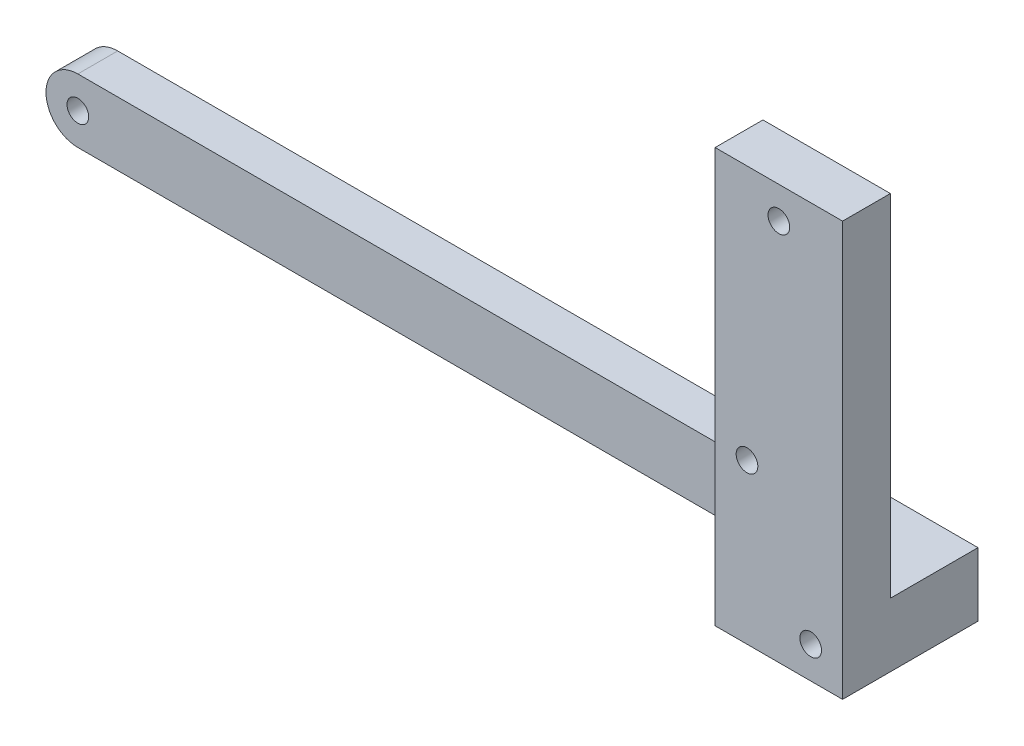
ISO-10303-21;
HEADER;
FILE_DESCRIPTION(('STEP AP214'),'2;1');
FILE_NAME('part.step','',(''),(''),'','','');
FILE_SCHEMA(('AUTOMOTIVE_DESIGN { 1 0 10303 214 1 1 1 1 }'));
ENDSEC;
DATA;
#1=APPLICATION_CONTEXT('core data for automotive mechanical design processes');
#2=APPLICATION_PROTOCOL_DEFINITION('international standard','automotive_design',2000,#1);
#3=PRODUCT_CONTEXT('',#1,'mechanical');
#4=PRODUCT('Part','Part','',(#3));
#5=PRODUCT_RELATED_PRODUCT_CATEGORY('part','',(#4));
#6=PRODUCT_DEFINITION_FORMATION('','',#4);
#7=PRODUCT_DEFINITION_CONTEXT('part definition',#1,'design');
#8=PRODUCT_DEFINITION('design','',#6,#7);
#9=PRODUCT_DEFINITION_SHAPE('','',#8);
#10=(LENGTH_UNIT() NAMED_UNIT(*) SI_UNIT(.MILLI.,.METRE.));
#11=(NAMED_UNIT(*) PLANE_ANGLE_UNIT() SI_UNIT($,.RADIAN.));
#12=(NAMED_UNIT(*) SI_UNIT($,.STERADIAN.) SOLID_ANGLE_UNIT());
#13=UNCERTAINTY_MEASURE_WITH_UNIT(LENGTH_MEASURE(1.E-05),#10,'distance_accuracy_value','');
#14=(GEOMETRIC_REPRESENTATION_CONTEXT(3) GLOBAL_UNCERTAINTY_ASSIGNED_CONTEXT((#13)) GLOBAL_UNIT_ASSIGNED_CONTEXT((#10,
#11,#12)) REPRESENTATION_CONTEXT('',''));
#15=CARTESIAN_POINT('',(0.,0.,0.));
#16=DIRECTION('',(0.,0.,1.));
#17=DIRECTION('',(1.,0.,0.));
#18=AXIS2_PLACEMENT_3D('',#15,#16,#17);
#19=CARTESIAN_POINT('',(-158.75,-69.850000000002,-9.525));
#20=DIRECTION('',(0.,0.,1.));
#21=DIRECTION('',(1.,0.,0.));
#22=AXIS2_PLACEMENT_3D('',#19,#20,#21);
#23=PLANE('',#22);
#24=CARTESIAN_POINT('',(-158.75,-69.850000000002,-9.525));
#25=DIRECTION('',(0.,0.,1.));
#26=DIRECTION('',(1.,0.,0.));
#27=AXIS2_PLACEMENT_3D('',#24,#25,#26);
#28=CIRCLE('',#27,6.34999999999999);
#29=CARTESIAN_POINT('',(-158.75,-63.500000000002,-9.525));
#30=VERTEX_POINT('',#29);
#31=CARTESIAN_POINT('',(-158.75,-76.2000000000019,-9.525));
#32=VERTEX_POINT('',#31);
#33=EDGE_CURVE('E101',#30,#32,#28,.T.);
#34=ORIENTED_EDGE('',*,*,#33,.T.);
#35=DIRECTION('',(1.,0.,0.));
#36=VECTOR('',#35,1.);
#37=CARTESIAN_POINT('',(-158.75,-76.2000000000019,-9.525));
#38=LINE('',#37,#36);
#39=CARTESIAN_POINT('',(12.7,-76.2,-9.525));
#40=VERTEX_POINT('',#39);
#41=EDGE_CURVE('E96',#32,#40,#38,.T.);
#42=ORIENTED_EDGE('',*,*,#41,.T.);
#43=DIRECTION('',(0.,1.,0.));
#44=VECTOR('',#43,1.);
#45=CARTESIAN_POINT('',(12.7,-76.2,-9.525));
#46=LINE('',#45,#44);
#47=CARTESIAN_POINT('',(12.7000000000005,-63.500000000002,-9.525));
#48=VERTEX_POINT('',#47);
#49=EDGE_CURVE('E99',#40,#48,#46,.T.);
#50=ORIENTED_EDGE('',*,*,#49,.T.);
#51=DIRECTION('',(-1.,0.,0.));
#52=VECTOR('',#51,1.);
#53=CARTESIAN_POINT('',(12.7000000000005,-63.500000000002,-9.525));
#54=LINE('',#53,#52);
#55=EDGE_CURVE('E66',#48,#30,#54,.T.);
#56=ORIENTED_EDGE('',*,*,#55,.T.);
#57=EDGE_LOOP('',(#34,#42,#50,#56));
#58=FACE_BOUND('',#57,.T.);
#59=CARTESIAN_POINT('',(-158.75,-69.850000000002,-9.525));
#60=DIRECTION('',(0.,0.,1.));
#61=DIRECTION('',(1.,0.,0.));
#62=AXIS2_PLACEMENT_3D('',#59,#60,#61);
#63=CIRCLE('',#62,2.15899999999999);
#64=CARTESIAN_POINT('',(-156.591,-69.850000000002,-9.525));
#65=VERTEX_POINT('',#64);
#66=EDGE_CURVE('E116',#65,#65,#63,.T.);
#67=ORIENTED_EDGE('',*,*,#66,.F.);
#68=EDGE_LOOP('',(#67));
#69=FACE_BOUND('',#68,.T.);
#70=ADVANCED_FACE('F49',(#58,#69),#23,.T.);
#71=CARTESIAN_POINT('',(-158.75,-69.850000000002,-17.4625));
#72=DIRECTION('',(0.,0.,1.));
#73=DIRECTION('',(1.,0.,0.));
#74=AXIS2_PLACEMENT_3D('',#71,#72,#73);
#75=PLANE('',#74);
#76=CARTESIAN_POINT('',(-158.75,-69.850000000002,-17.4625));
#77=DIRECTION('',(0.,0.,1.));
#78=DIRECTION('',(1.,0.,0.));
#79=AXIS2_PLACEMENT_3D('',#76,#77,#78);
#80=CIRCLE('',#79,6.34999999999999);
#81=CARTESIAN_POINT('',(-158.75,-63.500000000002,-17.4625));
#82=VERTEX_POINT('',#81);
#83=CARTESIAN_POINT('',(-158.75,-76.2000000000019,-17.4625));
#84=VERTEX_POINT('',#83);
#85=EDGE_CURVE('E113',#82,#84,#80,.T.);
#86=ORIENTED_EDGE('',*,*,#85,.F.);
#87=DIRECTION('',(-1.,0.,0.));
#88=VECTOR('',#87,1.);
#89=CARTESIAN_POINT('',(12.7000000000005,-63.500000000002,-17.4625));
#90=LINE('',#89,#88);
#91=CARTESIAN_POINT('',(12.7000000000005,-63.500000000002,-17.4625));
#92=VERTEX_POINT('',#91);
#93=EDGE_CURVE('E89',#92,#82,#90,.T.);
#94=ORIENTED_EDGE('',*,*,#93,.F.);
#95=DIRECTION('',(0.,1.,0.));
#96=VECTOR('',#95,1.);
#97=CARTESIAN_POINT('',(12.7,-76.2,-17.4625));
#98=LINE('',#97,#96);
#99=CARTESIAN_POINT('',(12.7,-76.2,-17.4625));
#100=VERTEX_POINT('',#99);
#101=EDGE_CURVE('E83',#100,#92,#98,.T.);
#102=ORIENTED_EDGE('',*,*,#101,.F.);
#103=DIRECTION('',(1.,0.,0.));
#104=VECTOR('',#103,1.);
#105=CARTESIAN_POINT('',(-158.75,-76.2000000000019,-17.4625));
#106=LINE('',#105,#104);
#107=EDGE_CURVE('E105',#84,#100,#106,.T.);
#108=ORIENTED_EDGE('',*,*,#107,.F.);
#109=EDGE_LOOP('',(#86,#94,#102,#108));
#110=FACE_BOUND('',#109,.T.);
#111=CARTESIAN_POINT('',(-158.75,-69.850000000002,-17.4625));
#112=DIRECTION('',(0.,0.,1.));
#113=DIRECTION('',(1.,0.,0.));
#114=AXIS2_PLACEMENT_3D('',#111,#112,#113);
#115=CIRCLE('',#114,2.15899999999999);
#116=CARTESIAN_POINT('',(-156.591,-69.850000000002,-17.4625));
#117=VERTEX_POINT('',#116);
#118=EDGE_CURVE('E128',#117,#117,#115,.T.);
#119=ORIENTED_EDGE('',*,*,#118,.T.);
#120=EDGE_LOOP('',(#119));
#121=FACE_BOUND('',#120,.T.);
#122=ADVANCED_FACE('F124',(#110,#121),#75,.F.);
#123=CARTESIAN_POINT('',(-158.75,-69.850000000002,-9.525));
#124=DIRECTION('',(0.,0.,-1.));
#125=DIRECTION('',(-1.,0.,0.));
#126=AXIS2_PLACEMENT_3D('',#123,#124,#125);
#127=CYLINDRICAL_SURFACE('',#126,6.34999999999999);
#128=ORIENTED_EDGE('',*,*,#85,.T.);
#129=DIRECTION('',(0.,0.,-1.));
#130=VECTOR('',#129,1.);
#131=CARTESIAN_POINT('',(-158.75,-76.2000000000019,-9.525));
#132=LINE('',#131,#130);
#133=EDGE_CURVE('E12',#32,#84,#132,.T.);
#134=ORIENTED_EDGE('',*,*,#133,.F.);
#135=ORIENTED_EDGE('',*,*,#33,.F.);
#136=DIRECTION('',(0.,0.,-1.));
#137=VECTOR('',#136,1.);
#138=CARTESIAN_POINT('',(-158.75,-63.500000000002,-9.525));
#139=LINE('',#138,#137);
#140=EDGE_CURVE('E109',#30,#82,#139,.T.);
#141=ORIENTED_EDGE('',*,*,#140,.T.);
#142=EDGE_LOOP('',(#128,#134,#135,#141));
#143=FACE_BOUND('',#142,.T.);
#144=ADVANCED_FACE('F51',(#143),#127,.T.);
#145=CARTESIAN_POINT('',(-158.75,-76.2000000000019,-9.525));
#146=DIRECTION('',(0.,1.,0.));
#147=DIRECTION('',(-1.,0.,0.));
#148=AXIS2_PLACEMENT_3D('',#145,#146,#147);
#149=PLANE('',#148);
#150=ORIENTED_EDGE('',*,*,#107,.T.);
#151=DIRECTION('',(0.,0.,-1.));
#152=VECTOR('',#151,1.);
#153=CARTESIAN_POINT('',(12.7,-76.2,-9.525));
#154=LINE('',#153,#152);
#155=EDGE_CURVE('E58',#40,#100,#154,.T.);
#156=ORIENTED_EDGE('',*,*,#155,.F.);
#157=ORIENTED_EDGE('',*,*,#41,.F.);
#158=ORIENTED_EDGE('',*,*,#133,.T.);
#159=EDGE_LOOP('',(#150,#156,#157,#158));
#160=FACE_BOUND('',#159,.T.);
#161=ADVANCED_FACE('F104',(#160),#149,.F.);
#162=CARTESIAN_POINT('',(12.7,-76.2,-9.525));
#163=DIRECTION('',(-1.,0.,0.));
#164=DIRECTION('',(0.,-1.,0.));
#165=AXIS2_PLACEMENT_3D('',#162,#163,#164);
#166=PLANE('',#165);
#167=ORIENTED_EDGE('',*,*,#101,.T.);
#168=DIRECTION('',(0.,0.,-1.));
#169=VECTOR('',#168,1.);
#170=CARTESIAN_POINT('',(12.7000000000005,-63.500000000002,-9.525));
#171=LINE('',#170,#169);
#172=EDGE_CURVE('E106',#48,#92,#171,.T.);
#173=ORIENTED_EDGE('',*,*,#172,.F.);
#174=ORIENTED_EDGE('',*,*,#49,.F.);
#175=ORIENTED_EDGE('',*,*,#155,.T.);
#176=EDGE_LOOP('',(#167,#173,#174,#175));
#177=FACE_BOUND('',#176,.T.);
#178=ADVANCED_FACE('F107',(#177),#166,.F.);
#179=CARTESIAN_POINT('',(12.7000000000005,-63.500000000002,-9.525));
#180=DIRECTION('',(0.,-1.,0.));
#181=DIRECTION('',(0.,0.,-1.));
#182=AXIS2_PLACEMENT_3D('',#179,#180,#181);
#183=PLANE('',#182);
#184=ORIENTED_EDGE('',*,*,#93,.T.);
#185=ORIENTED_EDGE('',*,*,#140,.F.);
#186=ORIENTED_EDGE('',*,*,#55,.F.);
#187=ORIENTED_EDGE('',*,*,#172,.T.);
#188=EDGE_LOOP('',(#184,#185,#186,#187));
#189=FACE_BOUND('',#188,.T.);
#190=ADVANCED_FACE('F121',(#189),#183,.F.);
#191=CARTESIAN_POINT('',(-158.75,-69.850000000002,-9.525));
#192=DIRECTION('',(0.,0.,-1.));
#193=DIRECTION('',(-1.,0.,0.));
#194=AXIS2_PLACEMENT_3D('',#191,#192,#193);
#195=CYLINDRICAL_SURFACE('',#194,2.15899999999999);
#196=ORIENTED_EDGE('',*,*,#66,.T.);
#197=EDGE_LOOP('',(#196));
#198=FACE_BOUND('',#197,.T.);
#199=ORIENTED_EDGE('',*,*,#118,.F.);
#200=EDGE_LOOP('',(#199));
#201=FACE_BOUND('',#200,.T.);
#202=ADVANCED_FACE('F134',(#198,#201),#195,.F.);
#203=CLOSED_SHELL('',(#70,#122,#144,#161,#178,#190,#202));
#204=MANIFOLD_SOLID_BREP('B2',#203);
#205=CARTESIAN_POINT('',(0.,0.,9.525));
#206=DIRECTION('',(0.,0.,1.));
#207=DIRECTION('',(1.,0.,0.));
#208=AXIS2_PLACEMENT_3D('',#205,#206,#207);
#209=PLANE('',#208);
#210=CARTESIAN_POINT('',(-6.35,-44.45,9.525));
#211=DIRECTION('',(0.,0.,1.));
#212=DIRECTION('',(1.,0.,0.));
#213=AXIS2_PLACEMENT_3D('',#210,#211,#212);
#214=CIRCLE('',#213,2.159);
#215=CARTESIAN_POINT('',(-8.50900000000001,-44.45,9.525));
#216=VERTEX_POINT('',#215);
#217=EDGE_CURVE('E289',#216,#216,#214,.T.);
#218=ORIENTED_EDGE('',*,*,#217,.F.);
#219=EDGE_LOOP('',(#218));
#220=FACE_BOUND('',#219,.T.);
#221=DIRECTION('',(0.,-1.,0.));
#222=VECTOR('',#221,1.);
#223=CARTESIAN_POINT('',(-12.7,6.35,9.525));
#224=LINE('',#223,#222);
#225=CARTESIAN_POINT('',(-12.7,6.35,9.525));
#226=VERTEX_POINT('',#225);
#227=CARTESIAN_POINT('',(-12.7,-76.2,9.525));
#228=VERTEX_POINT('',#227);
#229=EDGE_CURVE('E301',#226,#228,#224,.T.);
#230=ORIENTED_EDGE('',*,*,#229,.T.);
#231=DIRECTION('',(1.,0.,0.));
#232=VECTOR('',#231,1.);
#233=CARTESIAN_POINT('',(-12.7,-76.2,9.525));
#234=LINE('',#233,#232);
#235=CARTESIAN_POINT('',(12.7,-76.2,9.525));
#236=VERTEX_POINT('',#235);
#237=EDGE_CURVE('E240',#228,#236,#234,.T.);
#238=ORIENTED_EDGE('',*,*,#237,.T.);
#239=DIRECTION('',(0.,1.,0.));
#240=VECTOR('',#239,1.);
#241=CARTESIAN_POINT('',(12.7,6.34999999999999,9.525));
#242=LINE('',#241,#240);
#243=CARTESIAN_POINT('',(12.7,6.34999999999999,9.525));
#244=VERTEX_POINT('',#243);
#245=EDGE_CURVE('E304',#236,#244,#242,.T.);
#246=ORIENTED_EDGE('',*,*,#245,.T.);
#247=DIRECTION('',(-1.,0.,0.));
#248=VECTOR('',#247,1.);
#249=CARTESIAN_POINT('',(-12.7,6.35,9.525));
#250=LINE('',#249,#248);
#251=EDGE_CURVE('E218',#244,#226,#250,.T.);
#252=ORIENTED_EDGE('',*,*,#251,.T.);
#253=EDGE_LOOP('',(#230,#238,#246,#252));
#254=FACE_BOUND('',#253,.T.);
#255=CARTESIAN_POINT('',(0.,0.,9.525));
#256=DIRECTION('',(0.,0.,1.));
#257=DIRECTION('',(1.,0.,0.));
#258=AXIS2_PLACEMENT_3D('',#255,#256,#257);
#259=CIRCLE('',#258,2.159);
#260=CARTESIAN_POINT('',(-2.159,0.,9.525));
#261=VERTEX_POINT('',#260);
#262=EDGE_CURVE('E295',#261,#261,#259,.T.);
#263=ORIENTED_EDGE('',*,*,#262,.F.);
#264=EDGE_LOOP('',(#263));
#265=FACE_BOUND('',#264,.T.);
#266=CARTESIAN_POINT('',(6.35,-69.85,9.525));
#267=DIRECTION('',(0.,0.,1.));
#268=DIRECTION('',(1.,0.,0.));
#269=AXIS2_PLACEMENT_3D('',#266,#267,#268);
#270=CIRCLE('',#269,2.159);
#271=CARTESIAN_POINT('',(4.191,-69.85,9.525));
#272=VERTEX_POINT('',#271);
#273=EDGE_CURVE('E262',#272,#272,#270,.T.);
#274=ORIENTED_EDGE('',*,*,#273,.F.);
#275=EDGE_LOOP('',(#274));
#276=FACE_BOUND('',#275,.T.);
#277=ADVANCED_FACE('F194',(#220,#254,#265,#276),#209,.T.);
#278=CARTESIAN_POINT('',(0.,0.,0.));
#279=DIRECTION('',(0.,0.,1.));
#280=DIRECTION('',(1.,0.,0.));
#281=AXIS2_PLACEMENT_3D('',#278,#279,#280);
#282=PLANE('',#281);
#283=DIRECTION('',(0.,1.,0.));
#284=VECTOR('',#283,1.);
#285=CARTESIAN_POINT('',(12.7,6.34999999999999,0.));
#286=LINE('',#285,#284);
#287=CARTESIAN_POINT('',(12.7000000000005,-63.500000000002,0.));
#288=VERTEX_POINT('',#287);
#289=CARTESIAN_POINT('',(12.7,6.34999999999999,0.));
#290=VERTEX_POINT('',#289);
#291=EDGE_CURVE('E310',#288,#290,#286,.T.);
#292=ORIENTED_EDGE('',*,*,#291,.F.);
#293=DIRECTION('',(-1.,0.,0.));
#294=VECTOR('',#293,1.);
#295=CARTESIAN_POINT('',(12.7000000000005,-63.500000000002,0.));
#296=LINE('',#295,#294);
#297=CARTESIAN_POINT('',(-12.7,-63.500000000002,0.));
#298=VERTEX_POINT('',#297);
#299=EDGE_CURVE('E258',#288,#298,#296,.T.);
#300=ORIENTED_EDGE('',*,*,#299,.T.);
#301=DIRECTION('',(0.,-1.,0.));
#302=VECTOR('',#301,1.);
#303=CARTESIAN_POINT('',(-12.7,6.35,0.));
#304=LINE('',#303,#302);
#305=CARTESIAN_POINT('',(-12.7,6.35,0.));
#306=VERTEX_POINT('',#305);
#307=EDGE_CURVE('E298',#306,#298,#304,.T.);
#308=ORIENTED_EDGE('',*,*,#307,.F.);
#309=DIRECTION('',(-1.,0.,0.));
#310=VECTOR('',#309,1.);
#311=CARTESIAN_POINT('',(-12.7,6.35,0.));
#312=LINE('',#311,#310);
#313=EDGE_CURVE('E233',#290,#306,#312,.T.);
#314=ORIENTED_EDGE('',*,*,#313,.F.);
#315=EDGE_LOOP('',(#292,#300,#308,#314));
#316=FACE_BOUND('',#315,.T.);
#317=CARTESIAN_POINT('',(0.,0.,0.));
#318=DIRECTION('',(0.,0.,1.));
#319=DIRECTION('',(1.,0.,0.));
#320=AXIS2_PLACEMENT_3D('',#317,#318,#319);
#321=CIRCLE('',#320,2.159);
#322=CARTESIAN_POINT('',(-2.159,0.,0.));
#323=VERTEX_POINT('',#322);
#324=EDGE_CURVE('E292',#323,#323,#321,.T.);
#325=ORIENTED_EDGE('',*,*,#324,.T.);
#326=EDGE_LOOP('',(#325));
#327=FACE_BOUND('',#326,.T.);
#328=CARTESIAN_POINT('',(-6.35,-44.45,0.));
#329=DIRECTION('',(0.,0.,1.));
#330=DIRECTION('',(1.,0.,0.));
#331=AXIS2_PLACEMENT_3D('',#328,#329,#330);
#332=CIRCLE('',#331,2.159);
#333=CARTESIAN_POINT('',(-8.50900000000001,-44.45,0.));
#334=VERTEX_POINT('',#333);
#335=EDGE_CURVE('E288',#334,#334,#332,.T.);
#336=ORIENTED_EDGE('',*,*,#335,.T.);
#337=EDGE_LOOP('',(#336));
#338=FACE_BOUND('',#337,.T.);
#339=ADVANCED_FACE('F319',(#316,#327,#338),#282,.F.);
#340=CARTESIAN_POINT('',(-12.7,6.35,9.525));
#341=DIRECTION('',(1.,0.,0.));
#342=DIRECTION('',(0.,1.,0.));
#343=AXIS2_PLACEMENT_3D('',#340,#341,#342);
#344=PLANE('',#343);
#345=ORIENTED_EDGE('',*,*,#307,.T.);
#346=DIRECTION('',(0.,0.,-1.));
#347=VECTOR('',#346,1.);
#348=CARTESIAN_POINT('',(-12.6999999999995,-63.500000000002,28.3980633142469));
#349=LINE('',#348,#347);
#350=CARTESIAN_POINT('',(-12.6999999999995,-63.500000000002,-17.4625));
#351=VERTEX_POINT('',#350);
#352=EDGE_CURVE('E209',#298,#351,#349,.T.);
#353=ORIENTED_EDGE('',*,*,#352,.T.);
#354=DIRECTION('',(0.,-1.,0.));
#355=VECTOR('',#354,1.);
#356=CARTESIAN_POINT('',(-12.6999999999995,-63.500000000002,-17.4625));
#357=LINE('',#356,#355);
#358=CARTESIAN_POINT('',(-12.7,-76.2,-17.4625));
#359=VERTEX_POINT('',#358);
#360=EDGE_CURVE('E271',#351,#359,#357,.T.);
#361=ORIENTED_EDGE('',*,*,#360,.T.);
#362=DIRECTION('',(0.,0.,-1.));
#363=VECTOR('',#362,1.);
#364=CARTESIAN_POINT('',(-12.7,-76.2,9.525));
#365=LINE('',#364,#363);
#366=EDGE_CURVE('E47',#228,#359,#365,.T.);
#367=ORIENTED_EDGE('',*,*,#366,.F.);
#368=ORIENTED_EDGE('',*,*,#229,.F.);
#369=DIRECTION('',(0.,0.,-1.));
#370=VECTOR('',#369,1.);
#371=CARTESIAN_POINT('',(-12.7,6.35,9.525));
#372=LINE('',#371,#370);
#373=EDGE_CURVE('E307',#226,#306,#372,.T.);
#374=ORIENTED_EDGE('',*,*,#373,.T.);
#375=EDGE_LOOP('',(#345,#353,#361,#367,#368,#374));
#376=FACE_BOUND('',#375,.T.);
#377=ADVANCED_FACE('F196',(#376),#344,.F.);
#378=CARTESIAN_POINT('',(-12.7,-76.2,9.525));
#379=DIRECTION('',(0.,1.,0.));
#380=DIRECTION('',(0.,0.,1.));
#381=AXIS2_PLACEMENT_3D('',#378,#379,#380);
#382=PLANE('',#381);
#383=ORIENTED_EDGE('',*,*,#366,.T.);
#384=DIRECTION('',(1.,0.,0.));
#385=VECTOR('',#384,1.);
#386=CARTESIAN_POINT('',(12.7000000000005,-76.2,-17.4625));
#387=LINE('',#386,#385);
#388=CARTESIAN_POINT('',(12.7000000000005,-76.2,-17.4625));
#389=VERTEX_POINT('',#388);
#390=EDGE_CURVE('E283',#359,#389,#387,.T.);
#391=ORIENTED_EDGE('',*,*,#390,.T.);
#392=DIRECTION('',(0.,0.,-1.));
#393=VECTOR('',#392,1.);
#394=CARTESIAN_POINT('',(12.7,-76.2,9.525));
#395=LINE('',#394,#393);
#396=EDGE_CURVE('E202',#236,#389,#395,.T.);
#397=ORIENTED_EDGE('',*,*,#396,.F.);
#398=ORIENTED_EDGE('',*,*,#237,.F.);
#399=EDGE_LOOP('',(#383,#391,#397,#398));
#400=FACE_BOUND('',#399,.T.);
#401=ADVANCED_FACE('F325',(#400),#382,.F.);
#402=CARTESIAN_POINT('',(12.7,6.34999999999999,9.525));
#403=DIRECTION('',(-1.,0.,0.));
#404=DIRECTION('',(0.,-1.,0.));
#405=AXIS2_PLACEMENT_3D('',#402,#403,#404);
#406=PLANE('',#405);
#407=ORIENTED_EDGE('',*,*,#396,.T.);
#408=DIRECTION('',(0.,1.,0.));
#409=VECTOR('',#408,1.);
#410=CARTESIAN_POINT('',(12.7000000000005,-63.500000000002,-17.4625));
#411=LINE('',#410,#409);
#412=CARTESIAN_POINT('',(12.7000000000005,-63.500000000002,-17.4625));
#413=VERTEX_POINT('',#412);
#414=EDGE_CURVE('E269',#389,#413,#411,.T.);
#415=ORIENTED_EDGE('',*,*,#414,.T.);
#416=DIRECTION('',(0.,0.,-1.));
#417=VECTOR('',#416,1.);
#418=CARTESIAN_POINT('',(12.7000000000005,-63.500000000002,28.3980633142469));
#419=LINE('',#418,#417);
#420=EDGE_CURVE('E253',#288,#413,#419,.T.);
#421=ORIENTED_EDGE('',*,*,#420,.F.);
#422=ORIENTED_EDGE('',*,*,#291,.T.);
#423=DIRECTION('',(0.,0.,-1.));
#424=VECTOR('',#423,1.);
#425=CARTESIAN_POINT('',(12.7,6.34999999999999,9.525));
#426=LINE('',#425,#424);
#427=EDGE_CURVE('E314',#244,#290,#426,.T.);
#428=ORIENTED_EDGE('',*,*,#427,.F.);
#429=ORIENTED_EDGE('',*,*,#245,.F.);
#430=EDGE_LOOP('',(#407,#415,#421,#422,#428,#429));
#431=FACE_BOUND('',#430,.T.);
#432=ADVANCED_FACE('F273',(#431),#406,.F.);
#433=CARTESIAN_POINT('',(-12.7,6.35,9.525));
#434=DIRECTION('',(0.,-1.,0.));
#435=DIRECTION('',(1.,0.,0.));
#436=AXIS2_PLACEMENT_3D('',#433,#434,#435);
#437=PLANE('',#436);
#438=ORIENTED_EDGE('',*,*,#313,.T.);
#439=ORIENTED_EDGE('',*,*,#373,.F.);
#440=ORIENTED_EDGE('',*,*,#251,.F.);
#441=ORIENTED_EDGE('',*,*,#427,.T.);
#442=EDGE_LOOP('',(#438,#439,#440,#441));
#443=FACE_BOUND('',#442,.T.);
#444=ADVANCED_FACE('F316',(#443),#437,.F.);
#445=CARTESIAN_POINT('',(0.,0.,9.525));
#446=DIRECTION('',(0.,0.,-1.));
#447=DIRECTION('',(-1.,0.,0.));
#448=AXIS2_PLACEMENT_3D('',#445,#446,#447);
#449=CYLINDRICAL_SURFACE('',#448,2.159);
#450=CARTESIAN_POINT('',(-2.159,0.,9.525));
#451=CARTESIAN_POINT('',(-2.159,0.,9.42578125));
#452=CARTESIAN_POINT('',(-2.159,0.,9.3265625));
#453=CARTESIAN_POINT('',(-2.159,0.,9.128125));
#454=CARTESIAN_POINT('',(-2.159,0.,9.02890625));
#455=CARTESIAN_POINT('',(-2.159,0.,8.83046875));
#456=CARTESIAN_POINT('',(-2.159,0.,8.73125));
#457=CARTESIAN_POINT('',(-2.159,0.,8.5328125));
#458=CARTESIAN_POINT('',(-2.159,0.,8.43359375));
#459=CARTESIAN_POINT('',(-2.159,0.,8.23515625));
#460=CARTESIAN_POINT('',(-2.159,0.,8.1359375));
#461=CARTESIAN_POINT('',(-2.159,0.,7.9375));
#462=CARTESIAN_POINT('',(-2.159,0.,7.83828125));
#463=CARTESIAN_POINT('',(-2.159,0.,7.63984375));
#464=CARTESIAN_POINT('',(-2.159,0.,7.540625));
#465=CARTESIAN_POINT('',(-2.159,0.,7.3421875));
#466=CARTESIAN_POINT('',(-2.159,0.,7.24296875));
#467=CARTESIAN_POINT('',(-2.159,0.,7.04453125));
#468=CARTESIAN_POINT('',(-2.159,0.,6.9453125));
#469=CARTESIAN_POINT('',(-2.159,0.,6.746875));
#470=CARTESIAN_POINT('',(-2.159,0.,6.64765625));
#471=CARTESIAN_POINT('',(-2.159,0.,6.44921875));
#472=CARTESIAN_POINT('',(-2.159,0.,6.35));
#473=CARTESIAN_POINT('',(-2.159,0.,6.1515625));
#474=CARTESIAN_POINT('',(-2.159,0.,6.05234375));
#475=CARTESIAN_POINT('',(-2.159,0.,5.85390625));
#476=CARTESIAN_POINT('',(-2.159,0.,5.7546875));
#477=CARTESIAN_POINT('',(-2.159,0.,5.55625));
#478=CARTESIAN_POINT('',(-2.159,0.,5.45703125));
#479=CARTESIAN_POINT('',(-2.159,0.,5.25859375));
#480=CARTESIAN_POINT('',(-2.159,0.,5.159375));
#481=CARTESIAN_POINT('',(-2.159,0.,4.9609375));
#482=CARTESIAN_POINT('',(-2.159,0.,4.86171875));
#483=CARTESIAN_POINT('',(-2.159,0.,4.66328125));
#484=CARTESIAN_POINT('',(-2.159,0.,4.5640625));
#485=CARTESIAN_POINT('',(-2.159,0.,4.365625));
#486=CARTESIAN_POINT('',(-2.159,0.,4.26640625));
#487=CARTESIAN_POINT('',(-2.159,0.,4.06796875));
#488=CARTESIAN_POINT('',(-2.159,0.,3.96875));
#489=CARTESIAN_POINT('',(-2.159,0.,3.7703125));
#490=CARTESIAN_POINT('',(-2.159,0.,3.67109375));
#491=CARTESIAN_POINT('',(-2.159,0.,3.47265625));
#492=CARTESIAN_POINT('',(-2.159,0.,3.3734375));
#493=CARTESIAN_POINT('',(-2.159,0.,3.175));
#494=CARTESIAN_POINT('',(-2.159,0.,3.07578125));
#495=CARTESIAN_POINT('',(-2.159,0.,2.87734375));
#496=CARTESIAN_POINT('',(-2.159,0.,2.778125));
#497=CARTESIAN_POINT('',(-2.159,0.,2.5796875));
#498=CARTESIAN_POINT('',(-2.159,0.,2.48046875));
#499=CARTESIAN_POINT('',(-2.159,0.,2.28203125));
#500=CARTESIAN_POINT('',(-2.159,0.,2.1828125));
#501=CARTESIAN_POINT('',(-2.159,0.,1.984375));
#502=CARTESIAN_POINT('',(-2.159,0.,1.88515625));
#503=CARTESIAN_POINT('',(-2.159,0.,1.68671875));
#504=CARTESIAN_POINT('',(-2.159,0.,1.5875));
#505=CARTESIAN_POINT('',(-2.159,0.,1.3890625));
#506=CARTESIAN_POINT('',(-2.159,0.,1.28984375));
#507=CARTESIAN_POINT('',(-2.159,0.,1.09140625));
#508=CARTESIAN_POINT('',(-2.159,0.,0.992187500000001));
#509=CARTESIAN_POINT('',(-2.159,0.,0.793750000000001));
#510=CARTESIAN_POINT('',(-2.159,0.,0.69453125));
#511=CARTESIAN_POINT('',(-2.159,0.,0.49609375));
#512=CARTESIAN_POINT('',(-2.159,0.,0.396875));
#513=CARTESIAN_POINT('',(-2.159,0.,0.1984375));
#514=CARTESIAN_POINT('',(-2.159,0.,0.0992187500000001));
#515=CARTESIAN_POINT('',(-2.159,0.,0.));
#516=B_SPLINE_CURVE_WITH_KNOTS('',3,(#450,#451,#452,#453,#454,#455,#456,#457,#458,#459,#460,
#461,#462,#463,#464,#465,#466,#467,#468,#469,#470,#471,#472,#473,#474,#475,#476,#477,#478,#479,
#480,#481,#482,#483,#484,#485,#486,#487,#488,#489,#490,#491,#492,#493,#494,#495,#496,#497,#498,
#499,#500,#501,#502,#503,#504,#505,#506,#507,#508,#509,#510,#511,#512,#513,#514,#515),
.UNSPECIFIED.,.F.,.F.,(4,2,2,2,2,2,2,2,2,2,2,2,2,2,2,2,2,2,2,2,2,2,2,2,2,2,2,2,2,2,2,2,4),(0.,
0.297656249999998,0.595312499999999,0.892968749999999,1.190625,1.48828125,1.7859375,2.08359375,
2.38125,2.67890625,2.9765625,3.27421875,3.571875,3.86953125,4.1671875,4.46484375,4.7625,
5.06015625,5.3578125,5.65546875,5.953125,6.25078125,6.5484375,6.84609375,7.14375,7.44140625,
7.7390625,8.03671875,8.334375,8.63203125,8.9296875,9.22734375,9.525),.UNSPECIFIED.);
#517=EDGE_CURVE('BSEAM342',#261,#323,#516,.T.);
#518=ORIENTED_EDGE('',*,*,#262,.T.);
#519=ORIENTED_EDGE('',*,*,#324,.F.);
#520=ORIENTED_EDGE('',*,*,#517,.T.);
#521=ORIENTED_EDGE('',*,*,#517,.F.);
#522=EDGE_LOOP('',(#518,#520,#519,#521));
#523=FACE_BOUND('',#522,.T.);
#524=ADVANCED_FACE('F342',(#523),#449,.F.);
#525=CARTESIAN_POINT('',(-6.35,-44.45,9.525));
#526=DIRECTION('',(0.,0.,-1.));
#527=DIRECTION('',(-1.,0.,0.));
#528=AXIS2_PLACEMENT_3D('',#525,#526,#527);
#529=CYLINDRICAL_SURFACE('',#528,2.159);
#530=CARTESIAN_POINT('',(-8.50900000000001,-44.45,9.525));
#531=CARTESIAN_POINT('',(-8.50900000000001,-44.45,9.42578125));
#532=CARTESIAN_POINT('',(-8.50900000000001,-44.45,9.3265625));
#533=CARTESIAN_POINT('',(-8.50900000000001,-44.45,9.128125));
#534=CARTESIAN_POINT('',(-8.50900000000001,-44.45,9.02890625));
#535=CARTESIAN_POINT('',(-8.50900000000001,-44.45,8.83046875));
#536=CARTESIAN_POINT('',(-8.50900000000001,-44.45,8.73125));
#537=CARTESIAN_POINT('',(-8.50900000000001,-44.45,8.5328125));
#538=CARTESIAN_POINT('',(-8.50900000000001,-44.45,8.43359375));
#539=CARTESIAN_POINT('',(-8.50900000000001,-44.45,8.23515625));
#540=CARTESIAN_POINT('',(-8.50900000000001,-44.45,8.1359375));
#541=CARTESIAN_POINT('',(-8.50900000000001,-44.45,7.9375));
#542=CARTESIAN_POINT('',(-8.50900000000001,-44.45,7.83828125));
#543=CARTESIAN_POINT('',(-8.50900000000001,-44.45,7.63984375));
#544=CARTESIAN_POINT('',(-8.50900000000001,-44.45,7.540625));
#545=CARTESIAN_POINT('',(-8.50900000000001,-44.45,7.3421875));
#546=CARTESIAN_POINT('',(-8.50900000000001,-44.45,7.24296875));
#547=CARTESIAN_POINT('',(-8.50900000000001,-44.45,7.04453125));
#548=CARTESIAN_POINT('',(-8.50900000000001,-44.45,6.9453125));
#549=CARTESIAN_POINT('',(-8.50900000000001,-44.45,6.746875));
#550=CARTESIAN_POINT('',(-8.50900000000001,-44.45,6.64765625));
#551=CARTESIAN_POINT('',(-8.50900000000001,-44.45,6.44921875));
#552=CARTESIAN_POINT('',(-8.50900000000001,-44.45,6.35));
#553=CARTESIAN_POINT('',(-8.50900000000001,-44.45,6.1515625));
#554=CARTESIAN_POINT('',(-8.50900000000001,-44.45,6.05234375));
#555=CARTESIAN_POINT('',(-8.50900000000001,-44.45,5.85390625));
#556=CARTESIAN_POINT('',(-8.50900000000001,-44.45,5.7546875));
#557=CARTESIAN_POINT('',(-8.50900000000001,-44.45,5.55625));
#558=CARTESIAN_POINT('',(-8.50900000000001,-44.45,5.45703125));
#559=CARTESIAN_POINT('',(-8.50900000000001,-44.45,5.25859375));
#560=CARTESIAN_POINT('',(-8.50900000000001,-44.45,5.159375));
#561=CARTESIAN_POINT('',(-8.50900000000001,-44.45,4.9609375));
#562=CARTESIAN_POINT('',(-8.50900000000001,-44.45,4.86171875));
#563=CARTESIAN_POINT('',(-8.50900000000001,-44.45,4.66328125));
#564=CARTESIAN_POINT('',(-8.50900000000001,-44.45,4.5640625));
#565=CARTESIAN_POINT('',(-8.50900000000001,-44.45,4.365625));
#566=CARTESIAN_POINT('',(-8.50900000000001,-44.45,4.26640625));
#567=CARTESIAN_POINT('',(-8.50900000000001,-44.45,4.06796875));
#568=CARTESIAN_POINT('',(-8.50900000000001,-44.45,3.96875));
#569=CARTESIAN_POINT('',(-8.50900000000001,-44.45,3.7703125));
#570=CARTESIAN_POINT('',(-8.50900000000001,-44.45,3.67109375));
#571=CARTESIAN_POINT('',(-8.50900000000001,-44.45,3.47265625));
#572=CARTESIAN_POINT('',(-8.50900000000001,-44.45,3.3734375));
#573=CARTESIAN_POINT('',(-8.50900000000001,-44.45,3.175));
#574=CARTESIAN_POINT('',(-8.50900000000001,-44.45,3.07578125));
#575=CARTESIAN_POINT('',(-8.50900000000001,-44.45,2.87734375));
#576=CARTESIAN_POINT('',(-8.50900000000001,-44.45,2.778125));
#577=CARTESIAN_POINT('',(-8.50900000000001,-44.45,2.5796875));
#578=CARTESIAN_POINT('',(-8.50900000000001,-44.45,2.48046875));
#579=CARTESIAN_POINT('',(-8.50900000000001,-44.45,2.28203125));
#580=CARTESIAN_POINT('',(-8.50900000000001,-44.45,2.1828125));
#581=CARTESIAN_POINT('',(-8.50900000000001,-44.45,1.984375));
#582=CARTESIAN_POINT('',(-8.50900000000001,-44.45,1.88515625));
#583=CARTESIAN_POINT('',(-8.50900000000001,-44.45,1.68671875));
#584=CARTESIAN_POINT('',(-8.50900000000001,-44.45,1.5875));
#585=CARTESIAN_POINT('',(-8.50900000000001,-44.45,1.3890625));
#586=CARTESIAN_POINT('',(-8.50900000000001,-44.45,1.28984375));
#587=CARTESIAN_POINT('',(-8.50900000000001,-44.45,1.09140625));
#588=CARTESIAN_POINT('',(-8.50900000000001,-44.45,0.992187500000001));
#589=CARTESIAN_POINT('',(-8.50900000000001,-44.45,0.793750000000001));
#590=CARTESIAN_POINT('',(-8.50900000000001,-44.45,0.69453125));
#591=CARTESIAN_POINT('',(-8.50900000000001,-44.45,0.49609375));
#592=CARTESIAN_POINT('',(-8.50900000000001,-44.45,0.396875));
#593=CARTESIAN_POINT('',(-8.50900000000001,-44.45,0.1984375));
#594=CARTESIAN_POINT('',(-8.50900000000001,-44.45,0.0992187500000001));
#595=CARTESIAN_POINT('',(-8.50900000000001,-44.45,0.));
#596=B_SPLINE_CURVE_WITH_KNOTS('',3,(#530,#531,#532,#533,#534,#535,#536,#537,#538,#539,#540,
#541,#542,#543,#544,#545,#546,#547,#548,#549,#550,#551,#552,#553,#554,#555,#556,#557,#558,#559,
#560,#561,#562,#563,#564,#565,#566,#567,#568,#569,#570,#571,#572,#573,#574,#575,#576,#577,#578,
#579,#580,#581,#582,#583,#584,#585,#586,#587,#588,#589,#590,#591,#592,#593,#594,#595),
.UNSPECIFIED.,.F.,.F.,(4,2,2,2,2,2,2,2,2,2,2,2,2,2,2,2,2,2,2,2,2,2,2,2,2,2,2,2,2,2,2,2,4),(0.,
0.297656249999998,0.595312499999999,0.892968749999999,1.190625,1.48828125,1.7859375,2.08359375,
2.38125,2.67890625,2.9765625,3.27421875,3.571875,3.86953125,4.1671875,4.46484375,4.7625,
5.06015625,5.3578125,5.65546875,5.953125,6.25078125,6.5484375,6.84609375,7.14375,7.44140625,
7.7390625,8.03671875,8.334375,8.63203125,8.9296875,9.22734375,9.525),.UNSPECIFIED.);
#597=EDGE_CURVE('BSEAM348',#216,#334,#596,.T.);
#598=ORIENTED_EDGE('',*,*,#217,.T.);
#599=ORIENTED_EDGE('',*,*,#335,.F.);
#600=ORIENTED_EDGE('',*,*,#597,.T.);
#601=ORIENTED_EDGE('',*,*,#597,.F.);
#602=EDGE_LOOP('',(#598,#600,#599,#601));
#603=FACE_BOUND('',#602,.T.);
#604=ADVANCED_FACE('F348',(#603),#529,.F.);
#605=CARTESIAN_POINT('',(6.35,-69.85,9.525));
#606=DIRECTION('',(0.,0.,-1.));
#607=DIRECTION('',(-1.,0.,0.));
#608=AXIS2_PLACEMENT_3D('',#605,#606,#607);
#609=CYLINDRICAL_SURFACE('',#608,2.159);
#610=CARTESIAN_POINT('',(6.35,-69.85,-17.4625));
#611=DIRECTION('',(0.,0.,1.));
#612=DIRECTION('',(1.,0.,0.));
#613=AXIS2_PLACEMENT_3D('',#610,#611,#612);
#614=CIRCLE('',#613,2.15899999999988);
#615=CARTESIAN_POINT('',(4.191,-69.85,-17.4625));
#616=VERTEX_POINT('',#615);
#617=EDGE_CURVE('E276',#616,#616,#614,.T.);
#618=CARTESIAN_POINT('',(4.191,-69.85,9.525));
#619=CARTESIAN_POINT('',(4.191,-69.85,9.24388020833333));
#620=CARTESIAN_POINT('',(4.191,-69.85,8.96276041666667));
#621=CARTESIAN_POINT('',(4.191,-69.85,8.40052083333333));
#622=CARTESIAN_POINT('',(4.191,-69.85,8.11940104166666));
#623=CARTESIAN_POINT('',(4.191,-69.85,7.55716145833333));
#624=CARTESIAN_POINT('',(4.191,-69.85,7.27604166666667));
#625=CARTESIAN_POINT('',(4.191,-69.85,6.71380208333333));
#626=CARTESIAN_POINT('',(4.191,-69.85,6.43268229166667));
#627=CARTESIAN_POINT('',(4.191,-69.85,5.87044270833333));
#628=CARTESIAN_POINT('',(4.191,-69.85,5.58932291666667));
#629=CARTESIAN_POINT('',(4.191,-69.85,5.02708333333333));
#630=CARTESIAN_POINT('',(4.191,-69.85,4.74596354166667));
#631=CARTESIAN_POINT('',(4.191,-69.85,4.18372395833333));
#632=CARTESIAN_POINT('',(4.191,-69.85,3.90260416666667));
#633=CARTESIAN_POINT('',(4.191,-69.85,3.34036458333333));
#634=CARTESIAN_POINT('',(4.191,-69.85,3.05924479166667));
#635=CARTESIAN_POINT('',(4.191,-69.85,2.49700520833333));
#636=CARTESIAN_POINT('',(4.191,-69.85,2.21588541666667));
#637=CARTESIAN_POINT('',(4.191,-69.85,1.65364583333333));
#638=CARTESIAN_POINT('',(4.191,-69.85,1.37252604166667));
#639=CARTESIAN_POINT('',(4.191,-69.85,0.810286458333335));
#640=CARTESIAN_POINT('',(4.191,-69.85,0.529166666666668));
#641=CARTESIAN_POINT('',(4.191,-69.85,-0.0330729166666659));
#642=CARTESIAN_POINT('',(4.191,-69.85,-0.314192708333333));
#643=CARTESIAN_POINT('',(4.191,-69.85,-0.876432291666667));
#644=CARTESIAN_POINT('',(4.191,-69.85,-1.15755208333333));
#645=CARTESIAN_POINT('',(4.191,-69.85,-1.71979166666667));
#646=CARTESIAN_POINT('',(4.191,-69.85,-2.00091145833333));
#647=CARTESIAN_POINT('',(4.191,-69.85,-2.56315104166667));
#648=CARTESIAN_POINT('',(4.191,-69.85,-2.84427083333333));
#649=CARTESIAN_POINT('',(4.191,-69.85,-3.40651041666667));
#650=CARTESIAN_POINT('',(4.191,-69.85,-3.68763020833333));
#651=CARTESIAN_POINT('',(4.191,-69.85,-4.24986979166667));
#652=CARTESIAN_POINT('',(4.191,-69.85,-4.53098958333333));
#653=CARTESIAN_POINT('',(4.191,-69.85,-5.09322916666667));
#654=CARTESIAN_POINT('',(4.191,-69.85,-5.37434895833333));
#655=CARTESIAN_POINT('',(4.191,-69.85,-5.93658854166667));
#656=CARTESIAN_POINT('',(4.191,-69.85,-6.21770833333333));
#657=CARTESIAN_POINT('',(4.191,-69.85,-6.77994791666667));
#658=CARTESIAN_POINT('',(4.191,-69.85,-7.06106770833333));
#659=CARTESIAN_POINT('',(4.191,-69.85,-7.62330729166666));
#660=CARTESIAN_POINT('',(4.191,-69.85,-7.90442708333333));
#661=CARTESIAN_POINT('',(4.191,-69.85,-8.46666666666667));
#662=CARTESIAN_POINT('',(4.191,-69.85,-8.74778645833333));
#663=CARTESIAN_POINT('',(4.191,-69.85,-9.31002604166667));
#664=CARTESIAN_POINT('',(4.191,-69.85,-9.59114583333333));
#665=CARTESIAN_POINT('',(4.191,-69.85,-10.1533854166667));
#666=CARTESIAN_POINT('',(4.191,-69.85,-10.4345052083333));
#667=CARTESIAN_POINT('',(4.191,-69.85,-10.9967447916667));
#668=CARTESIAN_POINT('',(4.191,-69.85,-11.2778645833333));
#669=CARTESIAN_POINT('',(4.191,-69.85,-11.8401041666667));
#670=CARTESIAN_POINT('',(4.191,-69.85,-12.1212239583333));
#671=CARTESIAN_POINT('',(4.191,-69.85,-12.6834635416667));
#672=CARTESIAN_POINT('',(4.191,-69.85,-12.9645833333333));
#673=CARTESIAN_POINT('',(4.191,-69.85,-13.5268229166667));
#674=CARTESIAN_POINT('',(4.191,-69.85,-13.8079427083333));
#675=CARTESIAN_POINT('',(4.191,-69.85,-14.3701822916667));
#676=CARTESIAN_POINT('',(4.191,-69.85,-14.6513020833333));
#677=CARTESIAN_POINT('',(4.191,-69.85,-15.2135416666667));
#678=CARTESIAN_POINT('',(4.191,-69.85,-15.4946614583333));
#679=CARTESIAN_POINT('',(4.191,-69.85,-16.0569010416667));
#680=CARTESIAN_POINT('',(4.191,-69.85,-16.3380208333333));
#681=CARTESIAN_POINT('',(4.191,-69.85,-16.9002604166667));
#682=CARTESIAN_POINT('',(4.191,-69.85,-17.1813802083333));
#683=CARTESIAN_POINT('',(4.191,-69.85,-17.4625));
#684=B_SPLINE_CURVE_WITH_KNOTS('',3,(#618,#619,#620,#621,#622,#623,#624,#625,#626,#627,#628,
#629,#630,#631,#632,#633,#634,#635,#636,#637,#638,#639,#640,#641,#642,#643,#644,#645,#646,#647,
#648,#649,#650,#651,#652,#653,#654,#655,#656,#657,#658,#659,#660,#661,#662,#663,#664,#665,#666,
#667,#668,#669,#670,#671,#672,#673,#674,#675,#676,#677,#678,#679,#680,#681,#682,#683),
.UNSPECIFIED.,.F.,.F.,(4,2,2,2,2,2,2,2,2,2,2,2,2,2,2,2,2,2,2,2,2,2,2,2,2,2,2,2,2,2,2,2,4),(0.,
0.843359375000002,1.68671875,2.530078125,3.3734375,4.216796875,5.06015625,5.903515625,6.746875,
7.590234375,8.43359375,9.276953125,10.1203125,10.963671875,11.80703125,12.650390625,13.49375,
14.337109375,15.18046875,16.023828125,16.8671875,17.710546875,18.55390625,19.397265625,
20.240625,21.083984375,21.92734375,22.770703125,23.6140625,24.457421875,25.30078125,
26.144140625,26.9875),.UNSPECIFIED.);
#685=EDGE_CURVE('BSEAM353',#272,#616,#684,.T.);
#686=ORIENTED_EDGE('',*,*,#273,.T.);
#687=ORIENTED_EDGE('',*,*,#617,.F.);
#688=ORIENTED_EDGE('',*,*,#685,.T.);
#689=ORIENTED_EDGE('',*,*,#685,.F.);
#690=EDGE_LOOP('',(#686,#688,#687,#689));
#691=FACE_BOUND('',#690,.T.);
#692=ADVANCED_FACE('F353',(#691),#609,.F.);
#693=CARTESIAN_POINT('',(12.7000000000005,-63.500000000002,28.3980633142469));
#694=DIRECTION('',(0.,-1.,0.));
#695=DIRECTION('',(0.,0.,-1.));
#696=AXIS2_PLACEMENT_3D('',#693,#694,#695);
#697=PLANE('',#696);
#698=ORIENTED_EDGE('',*,*,#299,.F.);
#699=ORIENTED_EDGE('',*,*,#420,.T.);
#700=DIRECTION('',(-1.,0.,0.));
#701=VECTOR('',#700,1.);
#702=CARTESIAN_POINT('',(12.7000000000005,-63.500000000002,-17.4625));
#703=LINE('',#702,#701);
#704=EDGE_CURVE('E256',#413,#351,#703,.T.);
#705=ORIENTED_EDGE('',*,*,#704,.T.);
#706=ORIENTED_EDGE('',*,*,#352,.F.);
#707=EDGE_LOOP('',(#698,#699,#705,#706));
#708=FACE_BOUND('',#707,.T.);
#709=ADVANCED_FACE('F255',(#708),#697,.F.);
#710=CARTESIAN_POINT('',(0.,0.,-17.4625));
#711=DIRECTION('',(0.,0.,-1.));
#712=DIRECTION('',(-1.,0.,0.));
#713=AXIS2_PLACEMENT_3D('',#710,#711,#712);
#714=PLANE('',#713);
#715=ORIENTED_EDGE('',*,*,#414,.F.);
#716=ORIENTED_EDGE('',*,*,#390,.F.);
#717=ORIENTED_EDGE('',*,*,#360,.F.);
#718=ORIENTED_EDGE('',*,*,#704,.F.);
#719=EDGE_LOOP('',(#715,#716,#717,#718));
#720=FACE_BOUND('',#719,.T.);
#721=ORIENTED_EDGE('',*,*,#617,.T.);
#722=EDGE_LOOP('',(#721));
#723=FACE_BOUND('',#722,.T.);
#724=ADVANCED_FACE('F266',(#720,#723),#714,.T.);
#725=CLOSED_SHELL('',(#277,#339,#377,#401,#432,#444,#524,#604,#692,#709,#724));
#726=MANIFOLD_SOLID_BREP('B6',#725);
#727=ADVANCED_BREP_SHAPE_REPRESENTATION('',(#18,#204,#726),#14);
#728=SHAPE_DEFINITION_REPRESENTATION(#9,#727);
ENDSEC;
END-ISO-10303-21;
